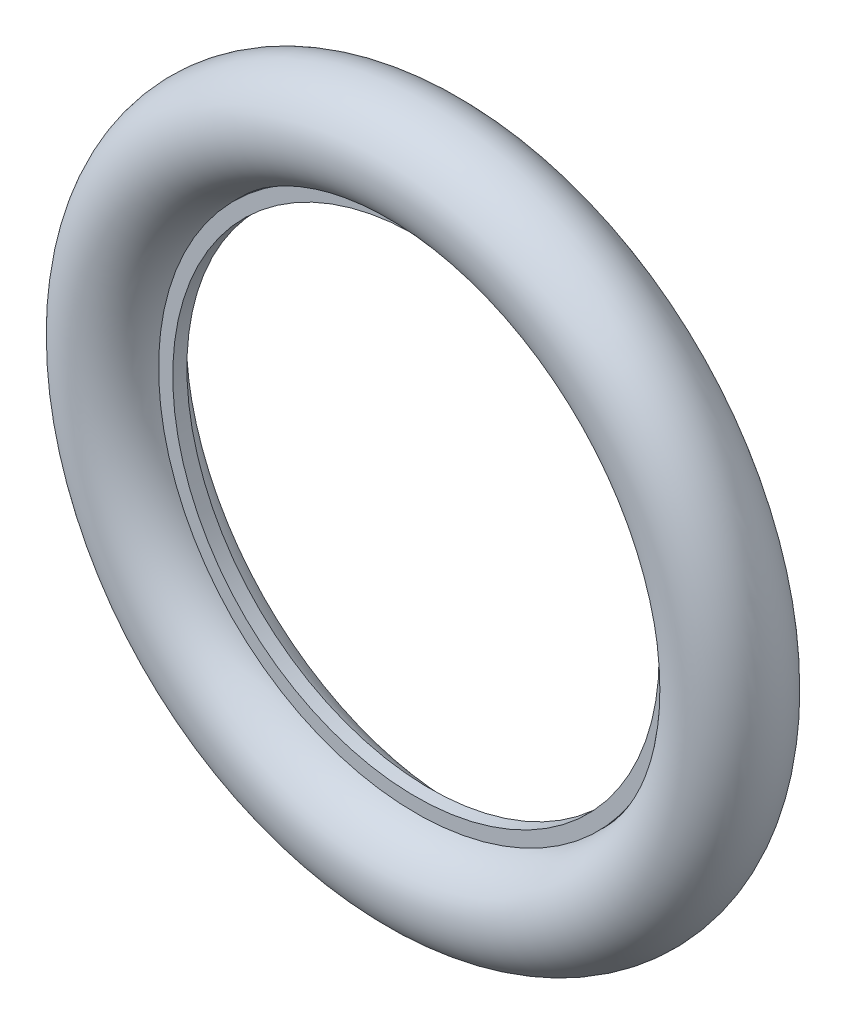
ISO-10303-21;
HEADER;
FILE_DESCRIPTION(('STEP AP214'),'2;1');
FILE_NAME('part.step','',(''),(''),'','','');
FILE_SCHEMA(('AUTOMOTIVE_DESIGN { 1 0 10303 214 1 1 1 1 }'));
ENDSEC;
DATA;
#1=APPLICATION_CONTEXT('core data for automotive mechanical design processes');
#2=APPLICATION_PROTOCOL_DEFINITION('international standard','automotive_design',2000,#1);
#3=PRODUCT_CONTEXT('',#1,'mechanical');
#4=PRODUCT('Part','Part','',(#3));
#5=PRODUCT_RELATED_PRODUCT_CATEGORY('part','',(#4));
#6=PRODUCT_DEFINITION_FORMATION('','',#4);
#7=PRODUCT_DEFINITION_CONTEXT('part definition',#1,'design');
#8=PRODUCT_DEFINITION('design','',#6,#7);
#9=PRODUCT_DEFINITION_SHAPE('','',#8);
#10=(LENGTH_UNIT() NAMED_UNIT(*) SI_UNIT(.MILLI.,.METRE.));
#11=(NAMED_UNIT(*) PLANE_ANGLE_UNIT() SI_UNIT($,.RADIAN.));
#12=(NAMED_UNIT(*) SI_UNIT($,.STERADIAN.) SOLID_ANGLE_UNIT());
#13=UNCERTAINTY_MEASURE_WITH_UNIT(LENGTH_MEASURE(1.E-05),#10,'distance_accuracy_value','');
#14=(GEOMETRIC_REPRESENTATION_CONTEXT(3) GLOBAL_UNCERTAINTY_ASSIGNED_CONTEXT((#13)) GLOBAL_UNIT_ASSIGNED_CONTEXT((#10,
#11,#12)) REPRESENTATION_CONTEXT('',''));
#15=CARTESIAN_POINT('',(0.,0.,0.));
#16=DIRECTION('',(0.,0.,1.));
#17=DIRECTION('',(1.,0.,0.));
#18=AXIS2_PLACEMENT_3D('',#15,#16,#17);
#19=CARTESIAN_POINT('',(0.,0.,0.127));
#20=DIRECTION('',(0.,0.,-1.));
#21=DIRECTION('',(-1.,0.,0.));
#22=AXIS2_PLACEMENT_3D('',#19,#20,#21);
#23=CYLINDRICAL_SURFACE('',#22,4.3688);
#24=CARTESIAN_POINT('',(0.,0.,0.127));
#25=DIRECTION('',(0.,0.,1.));
#26=DIRECTION('',(1.,0.,0.));
#27=AXIS2_PLACEMENT_3D('',#24,#25,#26);
#28=CIRCLE('',#27,4.3688);
#29=CARTESIAN_POINT('',(4.3688,0.,0.127));
#30=VERTEX_POINT('',#29);
#31=EDGE_CURVE('E46',#30,#30,#28,.T.);
#32=ORIENTED_EDGE('',*,*,#31,.T.);
#33=EDGE_LOOP('',(#32));
#34=FACE_BOUND('',#33,.T.);
#35=CARTESIAN_POINT('',(0.,0.,-0.127));
#36=DIRECTION('',(0.,0.,1.));
#37=DIRECTION('',(1.,0.,0.));
#38=AXIS2_PLACEMENT_3D('',#35,#36,#37);
#39=CIRCLE('',#38,4.3688);
#40=CARTESIAN_POINT('',(4.3688,0.,-0.127));
#41=VERTEX_POINT('',#40);
#42=EDGE_CURVE('E52',#41,#41,#39,.T.);
#43=ORIENTED_EDGE('',*,*,#42,.F.);
#44=EDGE_LOOP('',(#43));
#45=FACE_BOUND('',#44,.T.);
#46=ADVANCED_FACE('F39',(#34,#45),#23,.F.);
#47=CARTESIAN_POINT('',(0.,0.,0.127));
#48=DIRECTION('',(0.,0.,-1.));
#49=DIRECTION('',(-1.,0.,0.));
#50=AXIS2_PLACEMENT_3D('',#47,#48,#49);
#51=CYLINDRICAL_SURFACE('',#50,4.6228);
#52=CARTESIAN_POINT('',(0.,0.,0.127));
#53=DIRECTION('',(0.,0.,1.));
#54=DIRECTION('',(1.,0.,0.));
#55=AXIS2_PLACEMENT_3D('',#52,#53,#54);
#56=CIRCLE('',#55,4.6228);
#57=CARTESIAN_POINT('',(4.6228,0.,0.127));
#58=VERTEX_POINT('',#57);
#59=EDGE_CURVE('E11',#58,#58,#56,.T.);
#60=ORIENTED_EDGE('',*,*,#59,.F.);
#61=EDGE_LOOP('',(#60));
#62=FACE_BOUND('',#61,.T.);
#63=CARTESIAN_POINT('',(0.,0.,-0.127));
#64=DIRECTION('',(0.,0.,1.));
#65=DIRECTION('',(1.,0.,0.));
#66=AXIS2_PLACEMENT_3D('',#63,#64,#65);
#67=CIRCLE('',#66,4.6228);
#68=CARTESIAN_POINT('',(4.6228,0.,-0.127));
#69=VERTEX_POINT('',#68);
#70=EDGE_CURVE('E42',#69,#69,#67,.T.);
#71=ORIENTED_EDGE('',*,*,#70,.T.);
#72=EDGE_LOOP('',(#71));
#73=FACE_BOUND('',#72,.T.);
#74=ADVANCED_FACE('F59',(#62,#73),#51,.T.);
#75=CARTESIAN_POINT('',(0.,0.,0.127));
#76=DIRECTION('',(0.,0.,1.));
#77=DIRECTION('',(1.,0.,0.));
#78=AXIS2_PLACEMENT_3D('',#75,#76,#77);
#79=PLANE('',#78);
#80=ORIENTED_EDGE('',*,*,#31,.F.);
#81=EDGE_LOOP('',(#80));
#82=FACE_BOUND('',#81,.T.);
#83=ORIENTED_EDGE('',*,*,#59,.T.);
#84=EDGE_LOOP('',(#83));
#85=FACE_BOUND('',#84,.T.);
#86=ADVANCED_FACE('F63',(#82,#85),#79,.T.);
#87=CARTESIAN_POINT('',(0.,0.,-0.127));
#88=DIRECTION('',(0.,0.,1.));
#89=DIRECTION('',(1.,0.,0.));
#90=AXIS2_PLACEMENT_3D('',#87,#88,#89);
#91=PLANE('',#90);
#92=ORIENTED_EDGE('',*,*,#42,.T.);
#93=EDGE_LOOP('',(#92));
#94=FACE_BOUND('',#93,.T.);
#95=ORIENTED_EDGE('',*,*,#70,.F.);
#96=EDGE_LOOP('',(#95));
#97=FACE_BOUND('',#96,.T.);
#98=ADVANCED_FACE('F61',(#94,#97),#91,.F.);
#99=CLOSED_SHELL('',(#46,#74,#86,#98));
#100=MANIFOLD_SOLID_BREP('B2',#99);
#101=CARTESIAN_POINT('',(0.,0.,0.));
#102=DIRECTION('',(0.,0.,1.));
#103=DIRECTION('',(1.,0.,0.));
#104=AXIS2_PLACEMENT_3D('',#101,#102,#103);
#105=TOROIDAL_SURFACE('',#104,5.5118,0.888999999999998);
#106=CARTESIAN_POINT('',(6.4008,0.,0.));
#107=VERTEX_POINT('',#106);
#108=VERTEX_LOOP('',#107);
#109=FACE_BOUND('',#108,.T.);
#110=ADVANCED_FACE('F101',(#109),#105,.T.);
#111=CLOSED_SHELL('',(#110));
#112=MANIFOLD_SOLID_BREP('B6',#111);
#113=ADVANCED_BREP_SHAPE_REPRESENTATION('',(#18,#100,#112),#14);
#114=SHAPE_DEFINITION_REPRESENTATION(#9,#113);
ENDSEC;
END-ISO-10303-21;
